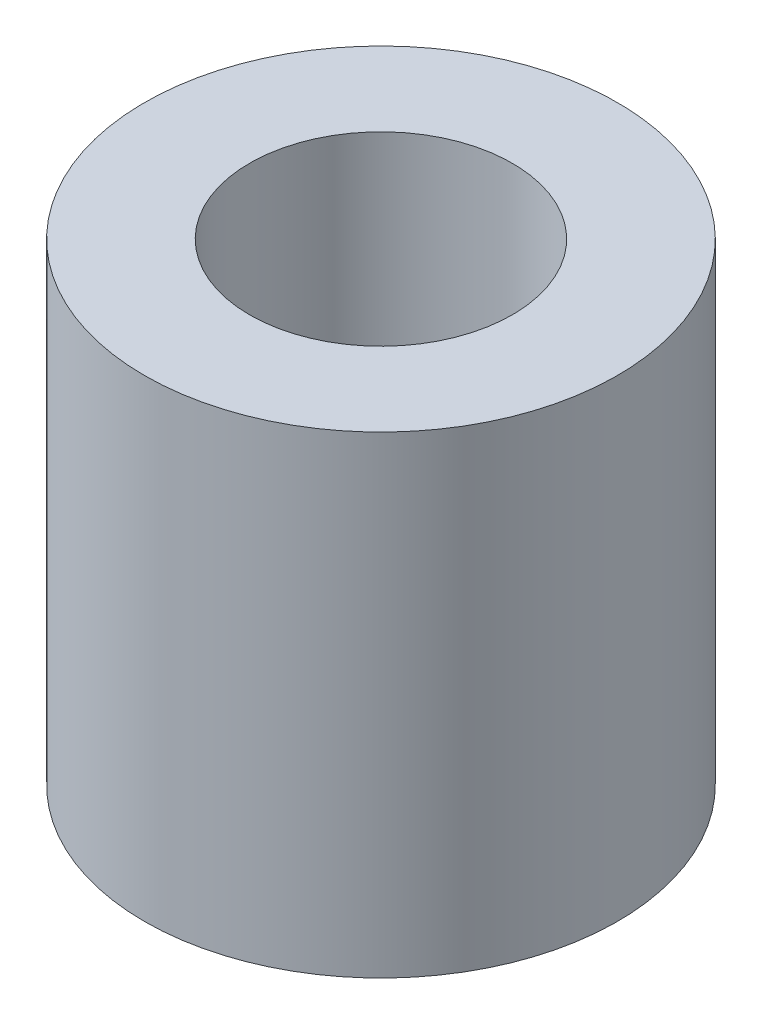
ISO-10303-21;
HEADER;
FILE_DESCRIPTION(('STEP AP214'),'2;1');
FILE_NAME('part.step','',(''),(''),'','','');
FILE_SCHEMA(('AUTOMOTIVE_DESIGN { 1 0 10303 214 1 1 1 1 }'));
ENDSEC;
DATA;
#1=APPLICATION_CONTEXT('core data for automotive mechanical design processes');
#2=APPLICATION_PROTOCOL_DEFINITION('international standard','automotive_design',2000,#1);
#3=PRODUCT_CONTEXT('',#1,'mechanical');
#4=PRODUCT('Part','Part','',(#3));
#5=PRODUCT_RELATED_PRODUCT_CATEGORY('part','',(#4));
#6=PRODUCT_DEFINITION_FORMATION('','',#4);
#7=PRODUCT_DEFINITION_CONTEXT('part definition',#1,'design');
#8=PRODUCT_DEFINITION('design','',#6,#7);
#9=PRODUCT_DEFINITION_SHAPE('','',#8);
#10=(LENGTH_UNIT() NAMED_UNIT(*) SI_UNIT(.MILLI.,.METRE.));
#11=(NAMED_UNIT(*) PLANE_ANGLE_UNIT() SI_UNIT($,.RADIAN.));
#12=(NAMED_UNIT(*) SI_UNIT($,.STERADIAN.) SOLID_ANGLE_UNIT());
#13=UNCERTAINTY_MEASURE_WITH_UNIT(LENGTH_MEASURE(1.E-05),#10,'distance_accuracy_value','');
#14=(GEOMETRIC_REPRESENTATION_CONTEXT(3) GLOBAL_UNCERTAINTY_ASSIGNED_CONTEXT((#13)) GLOBAL_UNIT_ASSIGNED_CONTEXT((#10,
#11,#12)) REPRESENTATION_CONTEXT('',''));
#15=CARTESIAN_POINT('',(0.,0.,0.));
#16=DIRECTION('',(0.,0.,1.));
#17=DIRECTION('',(1.,0.,0.));
#18=AXIS2_PLACEMENT_3D('',#15,#16,#17);
#19=CARTESIAN_POINT('',(0.,9.,0.));
#20=DIRECTION('',(0.,1.,0.));
#21=DIRECTION('',(0.,0.,1.));
#22=AXIS2_PLACEMENT_3D('',#19,#20,#21);
#23=PLANE('',#22);
#24=CARTESIAN_POINT('',(0.,9.,0.));
#25=DIRECTION('',(0.,1.,0.));
#26=DIRECTION('',(0.,0.,1.));
#27=AXIS2_PLACEMENT_3D('',#24,#25,#26);
#28=CIRCLE('',#27,4.5);
#29=CARTESIAN_POINT('',(0.,9.,4.5));
#30=VERTEX_POINT('',#29);
#31=EDGE_CURVE('E10',#30,#30,#28,.T.);
#32=ORIENTED_EDGE('',*,*,#31,.T.);
#33=EDGE_LOOP('',(#32));
#34=FACE_BOUND('',#33,.T.);
#35=CARTESIAN_POINT('',(0.,9.,0.));
#36=DIRECTION('',(0.,1.,0.));
#37=DIRECTION('',(0.,0.,1.));
#38=AXIS2_PLACEMENT_3D('',#35,#36,#37);
#39=CIRCLE('',#38,2.5);
#40=CARTESIAN_POINT('',(0.,9.,2.5));
#41=VERTEX_POINT('',#40);
#42=EDGE_CURVE('E48',#41,#41,#39,.T.);
#43=ORIENTED_EDGE('',*,*,#42,.F.);
#44=EDGE_LOOP('',(#43));
#45=FACE_BOUND('',#44,.T.);
#46=ADVANCED_FACE('F34',(#34,#45),#23,.T.);
#47=CARTESIAN_POINT('',(0.,0.,0.));
#48=DIRECTION('',(0.,1.,0.));
#49=DIRECTION('',(0.,0.,1.));
#50=AXIS2_PLACEMENT_3D('',#47,#48,#49);
#51=PLANE('',#50);
#52=CARTESIAN_POINT('',(0.,0.,0.));
#53=DIRECTION('',(0.,1.,0.));
#54=DIRECTION('',(0.,0.,1.));
#55=AXIS2_PLACEMENT_3D('',#52,#53,#54);
#56=CIRCLE('',#55,4.5);
#57=CARTESIAN_POINT('',(0.,0.,4.5));
#58=VERTEX_POINT('',#57);
#59=EDGE_CURVE('E38',#58,#58,#56,.T.);
#60=ORIENTED_EDGE('',*,*,#59,.F.);
#61=EDGE_LOOP('',(#60));
#62=FACE_BOUND('',#61,.T.);
#63=CARTESIAN_POINT('',(0.,0.,0.));
#64=DIRECTION('',(0.,1.,0.));
#65=DIRECTION('',(0.,0.,1.));
#66=AXIS2_PLACEMENT_3D('',#63,#64,#65);
#67=CIRCLE('',#66,2.5);
#68=CARTESIAN_POINT('',(0.,0.,2.5));
#69=VERTEX_POINT('',#68);
#70=EDGE_CURVE('E50',#69,#69,#67,.T.);
#71=ORIENTED_EDGE('',*,*,#70,.T.);
#72=EDGE_LOOP('',(#71));
#73=FACE_BOUND('',#72,.T.);
#74=ADVANCED_FACE('F61',(#62,#73),#51,.F.);
#75=CARTESIAN_POINT('',(0.,9.,0.));
#76=DIRECTION('',(0.,-1.,0.));
#77=DIRECTION('',(0.,0.,-1.));
#78=AXIS2_PLACEMENT_3D('',#75,#76,#77);
#79=CYLINDRICAL_SURFACE('',#78,4.5);
#80=ORIENTED_EDGE('',*,*,#31,.F.);
#81=EDGE_LOOP('',(#80));
#82=FACE_BOUND('',#81,.T.);
#83=ORIENTED_EDGE('',*,*,#59,.T.);
#84=EDGE_LOOP('',(#83));
#85=FACE_BOUND('',#84,.T.);
#86=ADVANCED_FACE('F36',(#82,#85),#79,.T.);
#87=CARTESIAN_POINT('',(0.,9.,0.));
#88=DIRECTION('',(0.,-1.,0.));
#89=DIRECTION('',(0.,0.,-1.));
#90=AXIS2_PLACEMENT_3D('',#87,#88,#89);
#91=CYLINDRICAL_SURFACE('',#90,2.5);
#92=ORIENTED_EDGE('',*,*,#42,.T.);
#93=EDGE_LOOP('',(#92));
#94=FACE_BOUND('',#93,.T.);
#95=ORIENTED_EDGE('',*,*,#70,.F.);
#96=EDGE_LOOP('',(#95));
#97=FACE_BOUND('',#96,.T.);
#98=ADVANCED_FACE('F57',(#94,#97),#91,.F.);
#99=CLOSED_SHELL('',(#46,#74,#86,#98));
#100=MANIFOLD_SOLID_BREP('B2',#99);
#101=ADVANCED_BREP_SHAPE_REPRESENTATION('',(#18,#100),#14);
#102=SHAPE_DEFINITION_REPRESENTATION(#9,#101);
ENDSEC;
END-ISO-10303-21;
